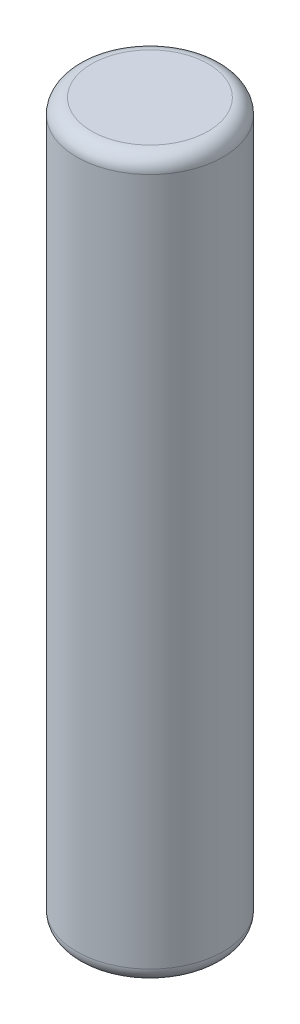
ISO-10303-21;
HEADER;
FILE_DESCRIPTION(('STEP AP214'),'2;1');
FILE_NAME('part.step','',(''),(''),'','','');
FILE_SCHEMA(('AUTOMOTIVE_DESIGN { 1 0 10303 214 1 1 1 1 }'));
ENDSEC;
DATA;
#1=APPLICATION_CONTEXT('core data for automotive mechanical design processes');
#2=APPLICATION_PROTOCOL_DEFINITION('international standard','automotive_design',2000,#1);
#3=PRODUCT_CONTEXT('',#1,'mechanical');
#4=PRODUCT('Part','Part','',(#3));
#5=PRODUCT_RELATED_PRODUCT_CATEGORY('part','',(#4));
#6=PRODUCT_DEFINITION_FORMATION('','',#4);
#7=PRODUCT_DEFINITION_CONTEXT('part definition',#1,'design');
#8=PRODUCT_DEFINITION('design','',#6,#7);
#9=PRODUCT_DEFINITION_SHAPE('','',#8);
#10=(LENGTH_UNIT() NAMED_UNIT(*) SI_UNIT(.MILLI.,.METRE.));
#11=(NAMED_UNIT(*) PLANE_ANGLE_UNIT() SI_UNIT($,.RADIAN.));
#12=(NAMED_UNIT(*) SI_UNIT($,.STERADIAN.) SOLID_ANGLE_UNIT());
#13=UNCERTAINTY_MEASURE_WITH_UNIT(LENGTH_MEASURE(1.E-05),#10,'distance_accuracy_value','');
#14=(GEOMETRIC_REPRESENTATION_CONTEXT(3) GLOBAL_UNCERTAINTY_ASSIGNED_CONTEXT((#13)) GLOBAL_UNIT_ASSIGNED_CONTEXT((#10,
#11,#12)) REPRESENTATION_CONTEXT('',''));
#15=CARTESIAN_POINT('',(0.,0.,0.));
#16=DIRECTION('',(0.,0.,1.));
#17=DIRECTION('',(1.,0.,0.));
#18=AXIS2_PLACEMENT_3D('',#15,#16,#17);
#19=CARTESIAN_POINT('',(0.,24.,0.));
#20=DIRECTION('',(0.,-1.,0.));
#21=DIRECTION('',(0.,0.,-1.));
#22=AXIS2_PLACEMENT_3D('',#19,#20,#21);
#23=CYLINDRICAL_SURFACE('',#22,2.45);
#24=CARTESIAN_POINT('',(0.,0.5,0.));
#25=DIRECTION('',(0.,1.,0.));
#26=DIRECTION('',(0.,0.,1.));
#27=AXIS2_PLACEMENT_3D('',#24,#25,#26);
#28=CIRCLE('',#27,2.45);
#29=CARTESIAN_POINT('',(0.,0.5,2.45));
#30=VERTEX_POINT('',#29);
#31=EDGE_CURVE('E50',#30,#30,#28,.T.);
#32=ORIENTED_EDGE('',*,*,#31,.T.);
#33=EDGE_LOOP('',(#32));
#34=FACE_BOUND('',#33,.T.);
#35=CARTESIAN_POINT('',(0.,23.5,0.));
#36=DIRECTION('',(0.,1.,0.));
#37=DIRECTION('',(0.,0.,1.));
#38=AXIS2_PLACEMENT_3D('',#35,#36,#37);
#39=CIRCLE('',#38,2.45);
#40=CARTESIAN_POINT('',(0.,23.5,2.45));
#41=VERTEX_POINT('',#40);
#42=EDGE_CURVE('E55',#41,#41,#39,.F.);
#43=ORIENTED_EDGE('',*,*,#42,.T.);
#44=EDGE_LOOP('',(#43));
#45=FACE_BOUND('',#44,.T.);
#46=ADVANCED_FACE('F37',(#34,#45),#23,.T.);
#47=CARTESIAN_POINT('',(0.,24.,0.));
#48=DIRECTION('',(0.,1.,0.));
#49=DIRECTION('',(0.,0.,1.));
#50=AXIS2_PLACEMENT_3D('',#47,#48,#49);
#51=PLANE('',#50);
#52=CARTESIAN_POINT('',(0.,24.,0.));
#53=DIRECTION('',(0.,1.,0.));
#54=DIRECTION('',(0.,0.,1.));
#55=AXIS2_PLACEMENT_3D('',#52,#53,#54);
#56=CIRCLE('',#55,1.95);
#57=CARTESIAN_POINT('',(0.,24.,1.95));
#58=VERTEX_POINT('',#57);
#59=EDGE_CURVE('E10',#58,#58,#56,.T.);
#60=ORIENTED_EDGE('',*,*,#59,.T.);
#61=EDGE_LOOP('',(#60));
#62=FACE_BOUND('',#61,.T.);
#63=ADVANCED_FACE('F72',(#62),#51,.T.);
#64=CARTESIAN_POINT('',(0.,0.,0.));
#65=DIRECTION('',(0.,1.,0.));
#66=DIRECTION('',(0.,0.,1.));
#67=AXIS2_PLACEMENT_3D('',#64,#65,#66);
#68=PLANE('',#67);
#69=CARTESIAN_POINT('',(0.,0.,0.));
#70=DIRECTION('',(0.,1.,0.));
#71=DIRECTION('',(0.,0.,1.));
#72=AXIS2_PLACEMENT_3D('',#69,#70,#71);
#73=CIRCLE('',#72,1.95);
#74=CARTESIAN_POINT('',(0.,0.,1.95));
#75=VERTEX_POINT('',#74);
#76=EDGE_CURVE('E45',#75,#75,#73,.F.);
#77=ORIENTED_EDGE('',*,*,#76,.T.);
#78=EDGE_LOOP('',(#77));
#79=FACE_BOUND('',#78,.T.);
#80=ADVANCED_FACE('F69',(#79),#68,.F.);
#81=CARTESIAN_POINT('',(0.,0.5,0.));
#82=DIRECTION('',(0.,1.,0.));
#83=DIRECTION('',(0.,0.,1.));
#84=AXIS2_PLACEMENT_3D('',#81,#82,#83);
#85=TOROIDAL_SURFACE('',#84,1.95,0.5);
#86=ORIENTED_EDGE('',*,*,#76,.F.);
#87=EDGE_LOOP('',(#86));
#88=FACE_BOUND('',#87,.T.);
#89=ORIENTED_EDGE('',*,*,#31,.F.);
#90=EDGE_LOOP('',(#89));
#91=FACE_BOUND('',#90,.T.);
#92=ADVANCED_FACE('F65',(#88,#91),#85,.T.);
#93=CARTESIAN_POINT('',(0.,23.5,0.));
#94=DIRECTION('',(0.,1.,0.));
#95=DIRECTION('',(0.,0.,1.));
#96=AXIS2_PLACEMENT_3D('',#93,#94,#95);
#97=TOROIDAL_SURFACE('',#96,1.95,0.5);
#98=ORIENTED_EDGE('',*,*,#42,.F.);
#99=EDGE_LOOP('',(#98));
#100=FACE_BOUND('',#99,.T.);
#101=ORIENTED_EDGE('',*,*,#59,.F.);
#102=EDGE_LOOP('',(#101));
#103=FACE_BOUND('',#102,.T.);
#104=ADVANCED_FACE('F39',(#100,#103),#97,.T.);
#105=CLOSED_SHELL('',(#46,#63,#80,#92,#104));
#106=MANIFOLD_SOLID_BREP('B2',#105);
#107=ADVANCED_BREP_SHAPE_REPRESENTATION('',(#18,#106),#14);
#108=SHAPE_DEFINITION_REPRESENTATION(#9,#107);
ENDSEC;
END-ISO-10303-21;
